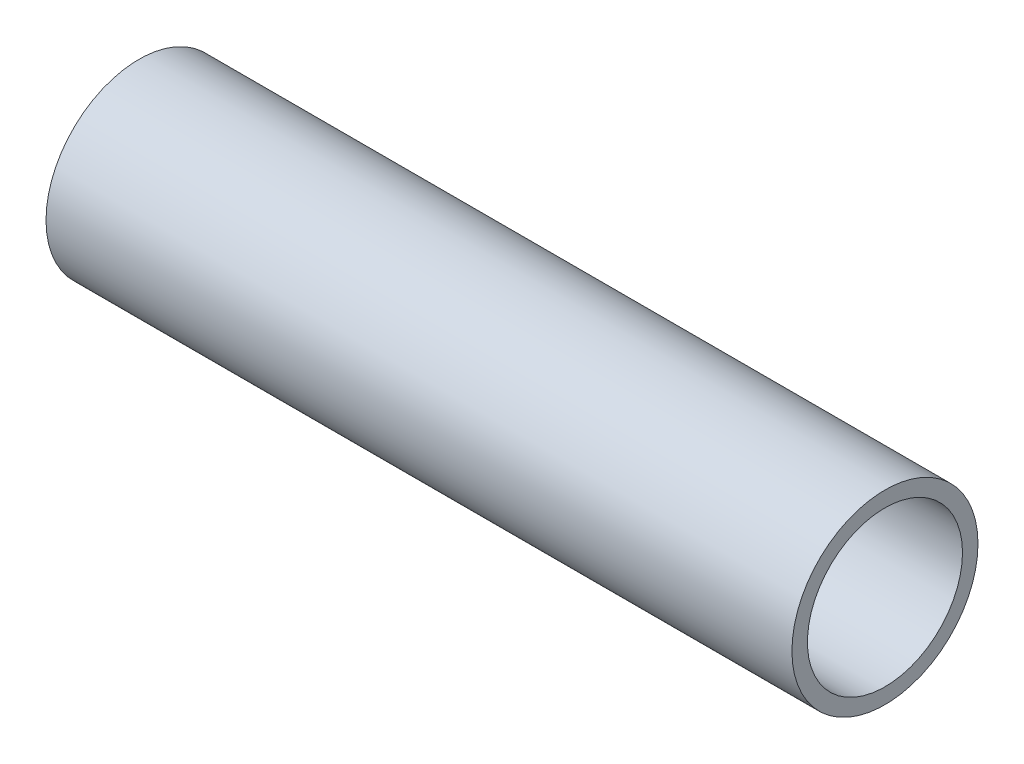
ISO-10303-21;
HEADER;
FILE_DESCRIPTION(('STEP AP214'),'2;1');
FILE_NAME('part.step','',(''),(''),'','','');
FILE_SCHEMA(('AUTOMOTIVE_DESIGN { 1 0 10303 214 1 1 1 1 }'));
ENDSEC;
DATA;
#1=APPLICATION_CONTEXT('core data for automotive mechanical design processes');
#2=APPLICATION_PROTOCOL_DEFINITION('international standard','automotive_design',2000,#1);
#3=PRODUCT_CONTEXT('',#1,'mechanical');
#4=PRODUCT('Part','Part','',(#3));
#5=PRODUCT_RELATED_PRODUCT_CATEGORY('part','',(#4));
#6=PRODUCT_DEFINITION_FORMATION('','',#4);
#7=PRODUCT_DEFINITION_CONTEXT('part definition',#1,'design');
#8=PRODUCT_DEFINITION('design','',#6,#7);
#9=PRODUCT_DEFINITION_SHAPE('','',#8);
#10=(LENGTH_UNIT() NAMED_UNIT(*) SI_UNIT(.MILLI.,.METRE.));
#11=(NAMED_UNIT(*) PLANE_ANGLE_UNIT() SI_UNIT($,.RADIAN.));
#12=(NAMED_UNIT(*) SI_UNIT($,.STERADIAN.) SOLID_ANGLE_UNIT());
#13=UNCERTAINTY_MEASURE_WITH_UNIT(LENGTH_MEASURE(1.E-05),#10,'distance_accuracy_value','');
#14=(GEOMETRIC_REPRESENTATION_CONTEXT(3) GLOBAL_UNCERTAINTY_ASSIGNED_CONTEXT((#13)) GLOBAL_UNIT_ASSIGNED_CONTEXT((#10,
#11,#12)) REPRESENTATION_CONTEXT('',''));
#15=CARTESIAN_POINT('',(0.,0.,0.));
#16=DIRECTION('',(0.,0.,1.));
#17=DIRECTION('',(1.,0.,0.));
#18=AXIS2_PLACEMENT_3D('',#15,#16,#17);
#19=CARTESIAN_POINT('',(96.21,0.,0.));
#20=DIRECTION('',(-1.,0.,0.));
#21=DIRECTION('',(0.,0.,1.));
#22=AXIS2_PLACEMENT_3D('',#19,#20,#21);
#23=CYLINDRICAL_SURFACE('',#22,10.);
#24=CARTESIAN_POINT('',(96.21,0.,0.));
#25=DIRECTION('',(1.,0.,0.));
#26=DIRECTION('',(0.,0.,-1.));
#27=AXIS2_PLACEMENT_3D('',#24,#25,#26);
#28=CIRCLE('',#27,10.);
#29=CARTESIAN_POINT('',(96.21,0.,-10.));
#30=VERTEX_POINT('',#29);
#31=EDGE_CURVE('E41',#30,#30,#28,.T.);
#32=ORIENTED_EDGE('',*,*,#31,.T.);
#33=EDGE_LOOP('',(#32));
#34=FACE_BOUND('',#33,.T.);
#35=CARTESIAN_POINT('',(0.,0.,0.));
#36=DIRECTION('',(1.,0.,0.));
#37=DIRECTION('',(0.,0.,-1.));
#38=AXIS2_PLACEMENT_3D('',#35,#36,#37);
#39=CIRCLE('',#38,10.);
#40=CARTESIAN_POINT('',(0.,0.,-10.));
#41=VERTEX_POINT('',#40);
#42=EDGE_CURVE('E47',#41,#41,#39,.T.);
#43=ORIENTED_EDGE('',*,*,#42,.F.);
#44=EDGE_LOOP('',(#43));
#45=FACE_BOUND('',#44,.T.);
#46=ADVANCED_FACE('F34',(#34,#45),#23,.F.);
#47=CARTESIAN_POINT('',(96.21,0.,0.));
#48=DIRECTION('',(-1.,0.,0.));
#49=DIRECTION('',(0.,0.,1.));
#50=AXIS2_PLACEMENT_3D('',#47,#48,#49);
#51=CYLINDRICAL_SURFACE('',#50,12.);
#52=CARTESIAN_POINT('',(96.21,0.,0.));
#53=DIRECTION('',(1.,0.,0.));
#54=DIRECTION('',(0.,0.,-1.));
#55=AXIS2_PLACEMENT_3D('',#52,#53,#54);
#56=CIRCLE('',#55,12.);
#57=CARTESIAN_POINT('',(96.21,0.,-12.));
#58=VERTEX_POINT('',#57);
#59=EDGE_CURVE('E10',#58,#58,#56,.T.);
#60=ORIENTED_EDGE('',*,*,#59,.F.);
#61=EDGE_LOOP('',(#60));
#62=FACE_BOUND('',#61,.T.);
#63=CARTESIAN_POINT('',(0.,0.,0.));
#64=DIRECTION('',(1.,0.,0.));
#65=DIRECTION('',(0.,0.,-1.));
#66=AXIS2_PLACEMENT_3D('',#63,#64,#65);
#67=CIRCLE('',#66,12.);
#68=CARTESIAN_POINT('',(0.,0.,-12.));
#69=VERTEX_POINT('',#68);
#70=EDGE_CURVE('E37',#69,#69,#67,.T.);
#71=ORIENTED_EDGE('',*,*,#70,.T.);
#72=EDGE_LOOP('',(#71));
#73=FACE_BOUND('',#72,.T.);
#74=ADVANCED_FACE('F54',(#62,#73),#51,.T.);
#75=CARTESIAN_POINT('',(96.21,0.,0.));
#76=DIRECTION('',(1.,0.,0.));
#77=DIRECTION('',(0.,0.,-1.));
#78=AXIS2_PLACEMENT_3D('',#75,#76,#77);
#79=PLANE('',#78);
#80=ORIENTED_EDGE('',*,*,#31,.F.);
#81=EDGE_LOOP('',(#80));
#82=FACE_BOUND('',#81,.T.);
#83=ORIENTED_EDGE('',*,*,#59,.T.);
#84=EDGE_LOOP('',(#83));
#85=FACE_BOUND('',#84,.T.);
#86=ADVANCED_FACE('F58',(#82,#85),#79,.T.);
#87=CARTESIAN_POINT('',(0.,0.,0.));
#88=DIRECTION('',(1.,0.,0.));
#89=DIRECTION('',(0.,0.,-1.));
#90=AXIS2_PLACEMENT_3D('',#87,#88,#89);
#91=PLANE('',#90);
#92=ORIENTED_EDGE('',*,*,#42,.T.);
#93=EDGE_LOOP('',(#92));
#94=FACE_BOUND('',#93,.T.);
#95=ORIENTED_EDGE('',*,*,#70,.F.);
#96=EDGE_LOOP('',(#95));
#97=FACE_BOUND('',#96,.T.);
#98=ADVANCED_FACE('F56',(#94,#97),#91,.F.);
#99=CLOSED_SHELL('',(#46,#74,#86,#98));
#100=MANIFOLD_SOLID_BREP('B2',#99);
#101=ADVANCED_BREP_SHAPE_REPRESENTATION('',(#18,#100),#14);
#102=SHAPE_DEFINITION_REPRESENTATION(#9,#101);
ENDSEC;
END-ISO-10303-21;
